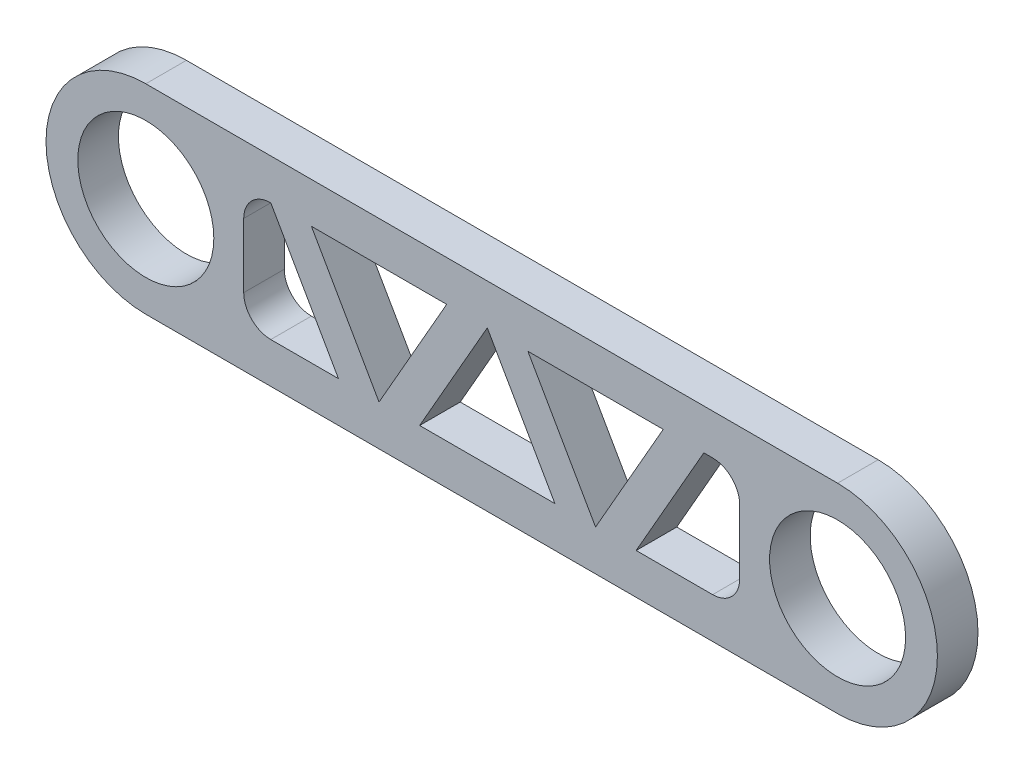
ISO-10303-21;
HEADER;
FILE_DESCRIPTION(('STEP AP214'),'2;1');
FILE_NAME('part.step','',(''),(''),'','','');
FILE_SCHEMA(('AUTOMOTIVE_DESIGN { 1 0 10303 214 1 1 1 1 }'));
ENDSEC;
DATA;
#1=APPLICATION_CONTEXT('core data for automotive mechanical design processes');
#2=APPLICATION_PROTOCOL_DEFINITION('international standard','automotive_design',2000,#1);
#3=PRODUCT_CONTEXT('',#1,'mechanical');
#4=PRODUCT('Part','Part','',(#3));
#5=PRODUCT_RELATED_PRODUCT_CATEGORY('part','',(#4));
#6=PRODUCT_DEFINITION_FORMATION('','',#4);
#7=PRODUCT_DEFINITION_CONTEXT('part definition',#1,'design');
#8=PRODUCT_DEFINITION('design','',#6,#7);
#9=PRODUCT_DEFINITION_SHAPE('','',#8);
#10=(LENGTH_UNIT() NAMED_UNIT(*) SI_UNIT(.MILLI.,.METRE.));
#11=(NAMED_UNIT(*) PLANE_ANGLE_UNIT() SI_UNIT($,.RADIAN.));
#12=(NAMED_UNIT(*) SI_UNIT($,.STERADIAN.) SOLID_ANGLE_UNIT());
#13=UNCERTAINTY_MEASURE_WITH_UNIT(LENGTH_MEASURE(1.E-05),#10,'distance_accuracy_value','');
#14=(GEOMETRIC_REPRESENTATION_CONTEXT(3) GLOBAL_UNCERTAINTY_ASSIGNED_CONTEXT((#13)) GLOBAL_UNIT_ASSIGNED_CONTEXT((#10,
#11,#12)) REPRESENTATION_CONTEXT('',''));
#15=CARTESIAN_POINT('',(0.,0.,0.));
#16=DIRECTION('',(0.,0.,1.));
#17=DIRECTION('',(1.,0.,0.));
#18=AXIS2_PLACEMENT_3D('',#15,#16,#17);
#19=CARTESIAN_POINT('',(0.,0.,-12.));
#20=DIRECTION('',(0.,0.,1.));
#21=DIRECTION('',(1.,0.,0.));
#22=AXIS2_PLACEMENT_3D('',#19,#20,#21);
#23=PLANE('',#22);
#24=CARTESIAN_POINT('',(204.48,0.,-12.));
#25=DIRECTION('',(0.,0.,1.));
#26=DIRECTION('',(1.,0.,0.));
#27=AXIS2_PLACEMENT_3D('',#24,#25,#26);
#28=CIRCLE('',#27,20.1);
#29=CARTESIAN_POINT('',(224.58,0.,-12.));
#30=VERTEX_POINT('',#29);
#31=EDGE_CURVE('E607',#30,#30,#28,.T.);
#32=ORIENTED_EDGE('',*,*,#31,.T.);
#33=EDGE_LOOP('',(#32));
#34=FACE_BOUND('',#33,.T.);
#35=CARTESIAN_POINT('',(0.,0.,-12.));
#36=DIRECTION('',(0.,0.,1.));
#37=DIRECTION('',(1.,0.,0.));
#38=AXIS2_PLACEMENT_3D('',#35,#36,#37);
#39=CIRCLE('',#38,20.1);
#40=CARTESIAN_POINT('',(20.1,0.,-12.));
#41=VERTEX_POINT('',#40);
#42=EDGE_CURVE('E321',#41,#41,#39,.T.);
#43=ORIENTED_EDGE('',*,*,#42,.T.);
#44=EDGE_LOOP('',(#43));
#45=FACE_BOUND('',#44,.T.);
#46=CARTESIAN_POINT('',(167.541061784718,9.5,-12.));
#47=DIRECTION('',(0.,0.,1.));
#48=DIRECTION('',(1.,0.,0.));
#49=AXIS2_PLACEMENT_3D('',#46,#47,#48);
#50=CIRCLE('',#49,8.);
#51=CARTESIAN_POINT('',(167.541061784718,17.5,-12.));
#52=VERTEX_POINT('',#51);
#53=CARTESIAN_POINT('',(175.541061784718,9.5,-12.));
#54=VERTEX_POINT('',#53);
#55=EDGE_CURVE('E302',#52,#54,#50,.F.);
#56=ORIENTED_EDGE('',*,*,#55,.F.);
#57=DIRECTION('',(1.,0.,0.));
#58=VECTOR('',#57,1.);
#59=CARTESIAN_POINT('',(0.,17.5,-12.));
#60=LINE('',#59,#58);
#61=CARTESIAN_POINT('',(164.938938215282,17.5,-12.));
#62=VERTEX_POINT('',#61);
#63=EDGE_CURVE('E290',#62,#52,#60,.T.);
#64=ORIENTED_EDGE('',*,*,#63,.F.);
#65=DIRECTION('',(0.496138938356834,0.868243142124459,0.));
#66=VECTOR('',#65,1.);
#67=CARTESIAN_POINT('',(116.800122654597,-66.7429272311983,-12.));
#68=LINE('',#67,#66);
#69=CARTESIAN_POINT('',(144.938938215282,-17.5,-12.));
#70=VERTEX_POINT('',#69);
#71=EDGE_CURVE('E301',#70,#62,#68,.T.);
#72=ORIENTED_EDGE('',*,*,#71,.F.);
#73=DIRECTION('',(1.,0.,0.));
#74=VECTOR('',#73,1.);
#75=CARTESIAN_POINT('',(0.,-17.5,-12.));
#76=LINE('',#75,#74);
#77=CARTESIAN_POINT('',(167.541061784718,-17.5,-12.));
#78=VERTEX_POINT('',#77);
#79=EDGE_CURVE('E325',#70,#78,#76,.T.);
#80=ORIENTED_EDGE('',*,*,#79,.T.);
#81=CARTESIAN_POINT('',(167.541061784718,-9.5,-12.));
#82=DIRECTION('',(0.,0.,1.));
#83=DIRECTION('',(1.,0.,0.));
#84=AXIS2_PLACEMENT_3D('',#81,#82,#83);
#85=CIRCLE('',#84,8.);
#86=CARTESIAN_POINT('',(175.541061784718,-9.5,-12.));
#87=VERTEX_POINT('',#86);
#88=EDGE_CURVE('E328',#78,#87,#85,.T.);
#89=ORIENTED_EDGE('',*,*,#88,.T.);
#90=DIRECTION('',(0.,-1.,0.));
#91=VECTOR('',#90,1.);
#92=CARTESIAN_POINT('',(175.541061784718,0.,-12.));
#93=LINE('',#92,#91);
#94=EDGE_CURVE('E310',#54,#87,#93,.T.);
#95=ORIENTED_EDGE('',*,*,#94,.F.);
#96=EDGE_LOOP('',(#56,#64,#72,#80,#89,#95));
#97=FACE_BOUND('',#96,.T.);
#98=DIRECTION('',(1.,0.,0.));
#99=VECTOR('',#98,1.);
#100=CARTESIAN_POINT('',(0.,17.5,-12.));
#101=LINE('',#100,#99);
#102=CARTESIAN_POINT('',(112.938938215282,17.5,-12.));
#103=VERTEX_POINT('',#102);
#104=CARTESIAN_POINT('',(152.938938215282,17.5,-12.));
#105=VERTEX_POINT('',#104);
#106=EDGE_CURVE('E359',#103,#105,#101,.T.);
#107=ORIENTED_EDGE('',*,*,#106,.F.);
#108=DIRECTION('',(0.496138938356834,-0.868243142124459,0.));
#109=VECTOR('',#108,1.);
#110=CARTESIAN_POINT('',(92.67704573152,52.9583118465829,-12.));
#111=LINE('',#110,#109);
#112=CARTESIAN_POINT('',(132.938938215282,-17.5,-12.));
#113=VERTEX_POINT('',#112);
#114=EDGE_CURVE('E352',#103,#113,#111,.T.);
#115=ORIENTED_EDGE('',*,*,#114,.T.);
#116=DIRECTION('',(0.496138938356834,0.868243142124459,0.));
#117=VECTOR('',#116,1.);
#118=CARTESIAN_POINT('',(107.753968808443,-61.5736964619675,-12.));
#119=LINE('',#118,#117);
#120=EDGE_CURVE('E355',#113,#105,#119,.T.);
#121=ORIENTED_EDGE('',*,*,#120,.T.);
#122=EDGE_LOOP('',(#107,#115,#121));
#123=FACE_BOUND('',#122,.T.);
#124=CARTESIAN_POINT('',(36.9389382152816,9.5,-12.));
#125=DIRECTION('',(0.,0.,1.));
#126=DIRECTION('',(1.,0.,0.));
#127=AXIS2_PLACEMENT_3D('',#124,#125,#126);
#128=CIRCLE('',#127,8.);
#129=CARTESIAN_POINT('',(36.9389382152816,17.5,-12.));
#130=VERTEX_POINT('',#129);
#131=CARTESIAN_POINT('',(28.9389382152816,9.5,-12.));
#132=VERTEX_POINT('',#131);
#133=EDGE_CURVE('E430',#130,#132,#128,.T.);
#134=ORIENTED_EDGE('',*,*,#133,.T.);
#135=DIRECTION('',(0.,-1.,0.));
#136=VECTOR('',#135,1.);
#137=CARTESIAN_POINT('',(28.9389382152816,0.,-12.));
#138=LINE('',#137,#136);
#139=CARTESIAN_POINT('',(28.9389382152816,-9.5,-12.));
#140=VERTEX_POINT('',#139);
#141=EDGE_CURVE('E418',#132,#140,#138,.T.);
#142=ORIENTED_EDGE('',*,*,#141,.T.);
#143=CARTESIAN_POINT('',(36.9389382152816,-9.5,-12.));
#144=DIRECTION('',(0.,0.,1.));
#145=DIRECTION('',(1.,0.,0.));
#146=AXIS2_PLACEMENT_3D('',#143,#144,#145);
#147=CIRCLE('',#146,8.);
#148=CARTESIAN_POINT('',(36.9389382152816,-17.5,-12.));
#149=VERTEX_POINT('',#148);
#150=EDGE_CURVE('E421',#140,#149,#147,.T.);
#151=ORIENTED_EDGE('',*,*,#150,.T.);
#152=DIRECTION('',(1.,0.,0.));
#153=VECTOR('',#152,1.);
#154=CARTESIAN_POINT('',(0.,-17.5,-12.));
#155=LINE('',#154,#153);
#156=CARTESIAN_POINT('',(56.9389382152816,-17.5,-12.));
#157=VERTEX_POINT('',#156);
#158=EDGE_CURVE('E425',#149,#157,#155,.T.);
#159=ORIENTED_EDGE('',*,*,#158,.T.);
#160=DIRECTION('',(0.496138938356834,-0.868243142124459,0.));
#161=VECTOR('',#160,1.);
#162=CARTESIAN_POINT('',(35.3847380392123,20.2198503081213,-12.));
#163=LINE('',#162,#161);
#164=EDGE_CURVE('E428',#130,#157,#163,.T.);
#165=ORIENTED_EDGE('',*,*,#164,.F.);
#166=EDGE_LOOP('',(#134,#142,#151,#159,#165));
#167=FACE_BOUND('',#166,.T.);
#168=CARTESIAN_POINT('',(0.,0.,-12.));
#169=DIRECTION('',(0.,0.,1.));
#170=DIRECTION('',(1.,0.,0.));
#171=AXIS2_PLACEMENT_3D('',#168,#169,#170);
#172=CIRCLE('',#171,29.5);
#173=CARTESIAN_POINT('',(0.,29.5,-12.));
#174=VERTEX_POINT('',#173);
#175=CARTESIAN_POINT('',(0.,-29.5,-12.));
#176=VERTEX_POINT('',#175);
#177=EDGE_CURVE('E457',#174,#176,#172,.T.);
#178=ORIENTED_EDGE('',*,*,#177,.F.);
#179=DIRECTION('',(1.,0.,0.));
#180=VECTOR('',#179,1.);
#181=CARTESIAN_POINT('',(0.,29.5,-12.));
#182=LINE('',#181,#180);
#183=CARTESIAN_POINT('',(204.48,29.5,-12.));
#184=VERTEX_POINT('',#183);
#185=EDGE_CURVE('E467',#174,#184,#182,.T.);
#186=ORIENTED_EDGE('',*,*,#185,.T.);
#187=CARTESIAN_POINT('',(204.48,0.,-12.));
#188=DIRECTION('',(0.,0.,1.));
#189=DIRECTION('',(1.,0.,0.));
#190=AXIS2_PLACEMENT_3D('',#187,#188,#189);
#191=CIRCLE('',#190,29.5);
#192=CARTESIAN_POINT('',(204.48,-29.5,-12.));
#193=VERTEX_POINT('',#192);
#194=EDGE_CURVE('E464',#193,#184,#191,.T.);
#195=ORIENTED_EDGE('',*,*,#194,.F.);
#196=DIRECTION('',(1.,0.,0.));
#197=VECTOR('',#196,1.);
#198=CARTESIAN_POINT('',(0.,-29.5,-12.));
#199=LINE('',#198,#197);
#200=EDGE_CURVE('E460',#176,#193,#199,.T.);
#201=ORIENTED_EDGE('',*,*,#200,.F.);
#202=EDGE_LOOP('',(#178,#186,#195,#201));
#203=FACE_BOUND('',#202,.T.);
#204=DIRECTION('',(1.,0.,0.));
#205=VECTOR('',#204,1.);
#206=CARTESIAN_POINT('',(0.,17.5,-12.));
#207=LINE('',#206,#205);
#208=CARTESIAN_POINT('',(48.9389382152816,17.5,-12.));
#209=VERTEX_POINT('',#208);
#210=CARTESIAN_POINT('',(88.9389382152817,17.5,-12.));
#211=VERTEX_POINT('',#210);
#212=EDGE_CURVE('E404',#209,#211,#207,.T.);
#213=ORIENTED_EDGE('',*,*,#212,.F.);
#214=DIRECTION('',(0.496138938356834,-0.868243142124459,0.));
#215=VECTOR('',#214,1.);
#216=CARTESIAN_POINT('',(44.4308918853661,25.3890810773521,-12.));
#217=LINE('',#216,#215);
#218=CARTESIAN_POINT('',(68.9389382152817,-17.5,-12.));
#219=VERTEX_POINT('',#218);
#220=EDGE_CURVE('E397',#209,#219,#217,.T.);
#221=ORIENTED_EDGE('',*,*,#220,.T.);
#222=DIRECTION('',(0.496138938356834,0.868243142124459,0.));
#223=VECTOR('',#222,1.);
#224=CARTESIAN_POINT('',(59.5078149622892,-34.0044656927367,-12.));
#225=LINE('',#224,#223);
#226=EDGE_CURVE('E400',#219,#211,#225,.T.);
#227=ORIENTED_EDGE('',*,*,#226,.T.);
#228=EDGE_LOOP('',(#213,#221,#227));
#229=FACE_BOUND('',#228,.T.);
#230=DIRECTION('',(0.496138938356834,-0.868243142124459,0.));
#231=VECTOR('',#230,1.);
#232=CARTESIAN_POINT('',(83.6308918853662,47.7890810773521,-12.));
#233=LINE('',#232,#231);
#234=CARTESIAN_POINT('',(100.938938215282,17.5,-12.));
#235=VERTEX_POINT('',#234);
#236=CARTESIAN_POINT('',(120.938938215282,-17.5,-12.));
#237=VERTEX_POINT('',#236);
#238=EDGE_CURVE('E376',#235,#237,#233,.T.);
#239=ORIENTED_EDGE('',*,*,#238,.F.);
#240=DIRECTION('',(0.496138938356834,0.868243142124459,0.));
#241=VECTOR('',#240,1.);
#242=CARTESIAN_POINT('',(68.5539688084431,-39.1736964619675,-12.));
#243=LINE('',#242,#241);
#244=CARTESIAN_POINT('',(80.9389382152817,-17.5,-12.));
#245=VERTEX_POINT('',#244);
#246=EDGE_CURVE('E378',#245,#235,#243,.T.);
#247=ORIENTED_EDGE('',*,*,#246,.F.);
#248=DIRECTION('',(1.,0.,0.));
#249=VECTOR('',#248,1.);
#250=CARTESIAN_POINT('',(0.,-17.5,-12.));
#251=LINE('',#250,#249);
#252=EDGE_CURVE('E143',#245,#237,#251,.T.);
#253=ORIENTED_EDGE('',*,*,#252,.T.);
#254=EDGE_LOOP('',(#239,#247,#253));
#255=FACE_BOUND('',#254,.T.);
#256=ADVANCED_FACE('F126',(#34,#45,#97,#123,#167,#203,#229,#255),#23,.F.);
#257=CARTESIAN_POINT('',(0.,0.,0.));
#258=DIRECTION('',(0.,0.,1.));
#259=DIRECTION('',(1.,0.,0.));
#260=AXIS2_PLACEMENT_3D('',#257,#258,#259);
#261=PLANE('',#260);
#262=CARTESIAN_POINT('',(204.48,0.,0.));
#263=DIRECTION('',(0.,0.,1.));
#264=DIRECTION('',(1.,0.,0.));
#265=AXIS2_PLACEMENT_3D('',#262,#263,#264);
#266=CIRCLE('',#265,20.1);
#267=CARTESIAN_POINT('',(224.58,0.,0.));
#268=VERTEX_POINT('',#267);
#269=EDGE_CURVE('E605',#268,#268,#266,.T.);
#270=ORIENTED_EDGE('',*,*,#269,.F.);
#271=EDGE_LOOP('',(#270));
#272=FACE_BOUND('',#271,.T.);
#273=CARTESIAN_POINT('',(0.,0.,0.));
#274=DIRECTION('',(0.,0.,1.));
#275=DIRECTION('',(1.,0.,0.));
#276=AXIS2_PLACEMENT_3D('',#273,#274,#275);
#277=CIRCLE('',#276,20.1);
#278=CARTESIAN_POINT('',(20.1,0.,0.));
#279=VERTEX_POINT('',#278);
#280=EDGE_CURVE('E608',#279,#279,#277,.T.);
#281=ORIENTED_EDGE('',*,*,#280,.F.);
#282=EDGE_LOOP('',(#281));
#283=FACE_BOUND('',#282,.T.);
#284=DIRECTION('',(0.496138938356834,-0.868243142124459,0.));
#285=VECTOR('',#284,1.);
#286=CARTESIAN_POINT('',(44.4308918853661,25.3890810773521,0.));
#287=LINE('',#286,#285);
#288=CARTESIAN_POINT('',(48.9389382152816,17.5,0.));
#289=VERTEX_POINT('',#288);
#290=CARTESIAN_POINT('',(68.9389382152817,-17.5,0.));
#291=VERTEX_POINT('',#290);
#292=EDGE_CURVE('E392',#289,#291,#287,.T.);
#293=ORIENTED_EDGE('',*,*,#292,.F.);
#294=DIRECTION('',(1.,0.,0.));
#295=VECTOR('',#294,1.);
#296=CARTESIAN_POINT('',(0.,17.5,0.));
#297=LINE('',#296,#295);
#298=CARTESIAN_POINT('',(88.9389382152817,17.5,0.));
#299=VERTEX_POINT('',#298);
#300=EDGE_CURVE('E401',#289,#299,#297,.T.);
#301=ORIENTED_EDGE('',*,*,#300,.T.);
#302=DIRECTION('',(0.496138938356834,0.868243142124459,0.));
#303=VECTOR('',#302,1.);
#304=CARTESIAN_POINT('',(59.5078149622892,-34.0044656927367,0.));
#305=LINE('',#304,#303);
#306=EDGE_CURVE('E408',#291,#299,#305,.T.);
#307=ORIENTED_EDGE('',*,*,#306,.F.);
#308=EDGE_LOOP('',(#293,#301,#307));
#309=FACE_BOUND('',#308,.T.);
#310=DIRECTION('',(0.496138938356834,-0.868243142124459,0.));
#311=VECTOR('',#310,1.);
#312=CARTESIAN_POINT('',(92.67704573152,52.9583118465829,0.));
#313=LINE('',#312,#311);
#314=CARTESIAN_POINT('',(112.938938215282,17.5,0.));
#315=VERTEX_POINT('',#314);
#316=CARTESIAN_POINT('',(132.938938215282,-17.5,0.));
#317=VERTEX_POINT('',#316);
#318=EDGE_CURVE('E344',#315,#317,#313,.T.);
#319=ORIENTED_EDGE('',*,*,#318,.F.);
#320=DIRECTION('',(1.,0.,0.));
#321=VECTOR('',#320,1.);
#322=CARTESIAN_POINT('',(0.,17.5,0.));
#323=LINE('',#322,#321);
#324=CARTESIAN_POINT('',(152.938938215282,17.5,0.));
#325=VERTEX_POINT('',#324);
#326=EDGE_CURVE('E356',#315,#325,#323,.T.);
#327=ORIENTED_EDGE('',*,*,#326,.T.);
#328=DIRECTION('',(0.496138938356834,0.868243142124459,0.));
#329=VECTOR('',#328,1.);
#330=CARTESIAN_POINT('',(107.753968808443,-61.5736964619675,0.));
#331=LINE('',#330,#329);
#332=EDGE_CURVE('E364',#317,#325,#331,.T.);
#333=ORIENTED_EDGE('',*,*,#332,.F.);
#334=EDGE_LOOP('',(#319,#327,#333));
#335=FACE_BOUND('',#334,.T.);
#336=DIRECTION('',(0.,-1.,0.));
#337=VECTOR('',#336,1.);
#338=CARTESIAN_POINT('',(28.9389382152816,0.,0.));
#339=LINE('',#338,#337);
#340=CARTESIAN_POINT('',(28.9389382152816,9.5,0.));
#341=VERTEX_POINT('',#340);
#342=CARTESIAN_POINT('',(28.9389382152816,-9.5,0.));
#343=VERTEX_POINT('',#342);
#344=EDGE_CURVE('E414',#341,#343,#339,.T.);
#345=ORIENTED_EDGE('',*,*,#344,.F.);
#346=CARTESIAN_POINT('',(36.9389382152816,9.5,0.));
#347=DIRECTION('',(0.,0.,1.));
#348=DIRECTION('',(1.,0.,0.));
#349=AXIS2_PLACEMENT_3D('',#346,#347,#348);
#350=CIRCLE('',#349,8.);
#351=CARTESIAN_POINT('',(36.9389382152816,17.5,0.));
#352=VERTEX_POINT('',#351);
#353=EDGE_CURVE('E422',#352,#341,#350,.T.);
#354=ORIENTED_EDGE('',*,*,#353,.F.);
#355=DIRECTION('',(0.496138938356834,-0.868243142124459,0.));
#356=VECTOR('',#355,1.);
#357=CARTESIAN_POINT('',(35.3847380392123,20.2198503081213,0.));
#358=LINE('',#357,#356);
#359=CARTESIAN_POINT('',(56.9389382152816,-17.5,0.));
#360=VERTEX_POINT('',#359);
#361=EDGE_CURVE('E441',#352,#360,#358,.T.);
#362=ORIENTED_EDGE('',*,*,#361,.T.);
#363=DIRECTION('',(1.,0.,0.));
#364=VECTOR('',#363,1.);
#365=CARTESIAN_POINT('',(0.,-17.5,0.));
#366=LINE('',#365,#364);
#367=CARTESIAN_POINT('',(36.9389382152816,-17.5,0.));
#368=VERTEX_POINT('',#367);
#369=EDGE_CURVE('E438',#368,#360,#366,.T.);
#370=ORIENTED_EDGE('',*,*,#369,.F.);
#371=CARTESIAN_POINT('',(36.9389382152816,-9.5,0.));
#372=DIRECTION('',(0.,0.,1.));
#373=DIRECTION('',(1.,0.,0.));
#374=AXIS2_PLACEMENT_3D('',#371,#372,#373);
#375=CIRCLE('',#374,8.);
#376=EDGE_CURVE('E435',#343,#368,#375,.T.);
#377=ORIENTED_EDGE('',*,*,#376,.F.);
#378=EDGE_LOOP('',(#345,#354,#362,#370,#377));
#379=FACE_BOUND('',#378,.T.);
#380=CARTESIAN_POINT('',(0.,0.,0.));
#381=DIRECTION('',(0.,0.,1.));
#382=DIRECTION('',(1.,0.,0.));
#383=AXIS2_PLACEMENT_3D('',#380,#381,#382);
#384=CIRCLE('',#383,29.5);
#385=CARTESIAN_POINT('',(0.,29.5,0.));
#386=VERTEX_POINT('',#385);
#387=CARTESIAN_POINT('',(0.,-29.5,0.));
#388=VERTEX_POINT('',#387);
#389=EDGE_CURVE('E448',#386,#388,#384,.T.);
#390=ORIENTED_EDGE('',*,*,#389,.T.);
#391=DIRECTION('',(1.,0.,0.));
#392=VECTOR('',#391,1.);
#393=CARTESIAN_POINT('',(0.,-29.5,0.));
#394=LINE('',#393,#392);
#395=CARTESIAN_POINT('',(204.48,-29.5,0.));
#396=VERTEX_POINT('',#395);
#397=EDGE_CURVE('E471',#388,#396,#394,.T.);
#398=ORIENTED_EDGE('',*,*,#397,.T.);
#399=CARTESIAN_POINT('',(204.48,0.,0.));
#400=DIRECTION('',(0.,0.,1.));
#401=DIRECTION('',(1.,0.,0.));
#402=AXIS2_PLACEMENT_3D('',#399,#400,#401);
#403=CIRCLE('',#402,29.5);
#404=CARTESIAN_POINT('',(204.48,29.5,0.));
#405=VERTEX_POINT('',#404);
#406=EDGE_CURVE('E474',#396,#405,#403,.T.);
#407=ORIENTED_EDGE('',*,*,#406,.T.);
#408=DIRECTION('',(1.,0.,0.));
#409=VECTOR('',#408,1.);
#410=CARTESIAN_POINT('',(0.,29.5,0.));
#411=LINE('',#410,#409);
#412=EDGE_CURVE('E461',#386,#405,#411,.T.);
#413=ORIENTED_EDGE('',*,*,#412,.F.);
#414=EDGE_LOOP('',(#390,#398,#407,#413));
#415=FACE_BOUND('',#414,.T.);
#416=DIRECTION('',(1.,0.,0.));
#417=VECTOR('',#416,1.);
#418=CARTESIAN_POINT('',(0.,17.5,0.));
#419=LINE('',#418,#417);
#420=CARTESIAN_POINT('',(164.938938215282,17.5,0.));
#421=VERTEX_POINT('',#420);
#422=CARTESIAN_POINT('',(167.541061784718,17.5,0.));
#423=VERTEX_POINT('',#422);
#424=EDGE_CURVE('E332',#421,#423,#419,.T.);
#425=ORIENTED_EDGE('',*,*,#424,.T.);
#426=CARTESIAN_POINT('',(167.541061784718,9.5,0.));
#427=DIRECTION('',(0.,0.,1.));
#428=DIRECTION('',(1.,0.,0.));
#429=AXIS2_PLACEMENT_3D('',#426,#427,#428);
#430=CIRCLE('',#429,8.);
#431=CARTESIAN_POINT('',(175.541061784718,9.5,0.));
#432=VERTEX_POINT('',#431);
#433=EDGE_CURVE('E309',#423,#432,#430,.F.);
#434=ORIENTED_EDGE('',*,*,#433,.T.);
#435=DIRECTION('',(0.,-1.,0.));
#436=VECTOR('',#435,1.);
#437=CARTESIAN_POINT('',(175.541061784718,0.,0.));
#438=LINE('',#437,#436);
#439=CARTESIAN_POINT('',(175.541061784718,-9.5,0.));
#440=VERTEX_POINT('',#439);
#441=EDGE_CURVE('E315',#432,#440,#438,.T.);
#442=ORIENTED_EDGE('',*,*,#441,.T.);
#443=CARTESIAN_POINT('',(167.541061784718,-9.5,0.));
#444=DIRECTION('',(0.,0.,1.));
#445=DIRECTION('',(1.,0.,0.));
#446=AXIS2_PLACEMENT_3D('',#443,#444,#445);
#447=CIRCLE('',#446,8.);
#448=CARTESIAN_POINT('',(167.541061784718,-17.5,0.));
#449=VERTEX_POINT('',#448);
#450=EDGE_CURVE('E318',#449,#440,#447,.T.);
#451=ORIENTED_EDGE('',*,*,#450,.F.);
#452=DIRECTION('',(1.,0.,0.));
#453=VECTOR('',#452,1.);
#454=CARTESIAN_POINT('',(0.,-17.5,0.));
#455=LINE('',#454,#453);
#456=CARTESIAN_POINT('',(144.938938215282,-17.5,0.));
#457=VERTEX_POINT('',#456);
#458=EDGE_CURVE('E337',#457,#449,#455,.T.);
#459=ORIENTED_EDGE('',*,*,#458,.F.);
#460=DIRECTION('',(0.496138938356834,0.868243142124459,0.));
#461=VECTOR('',#460,1.);
#462=CARTESIAN_POINT('',(116.800122654597,-66.7429272311983,0.));
#463=LINE('',#462,#461);
#464=EDGE_CURVE('E334',#457,#421,#463,.T.);
#465=ORIENTED_EDGE('',*,*,#464,.T.);
#466=EDGE_LOOP('',(#425,#434,#442,#451,#459,#465));
#467=FACE_BOUND('',#466,.T.);
#468=DIRECTION('',(0.496138938356834,0.868243142124459,0.));
#469=VECTOR('',#468,1.);
#470=CARTESIAN_POINT('',(68.5539688084431,-39.1736964619675,0.));
#471=LINE('',#470,#469);
#472=CARTESIAN_POINT('',(80.9389382152817,-17.5,0.));
#473=VERTEX_POINT('',#472);
#474=CARTESIAN_POINT('',(100.938938215282,17.5,0.));
#475=VERTEX_POINT('',#474);
#476=EDGE_CURVE('E385',#473,#475,#471,.T.);
#477=ORIENTED_EDGE('',*,*,#476,.T.);
#478=DIRECTION('',(0.496138938356834,-0.868243142124459,0.));
#479=VECTOR('',#478,1.);
#480=CARTESIAN_POINT('',(83.6308918853662,47.7890810773521,0.));
#481=LINE('',#480,#479);
#482=CARTESIAN_POINT('',(120.938938215282,-17.5,0.));
#483=VERTEX_POINT('',#482);
#484=EDGE_CURVE('E371',#475,#483,#481,.T.);
#485=ORIENTED_EDGE('',*,*,#484,.T.);
#486=DIRECTION('',(1.,0.,0.));
#487=VECTOR('',#486,1.);
#488=CARTESIAN_POINT('',(0.,-17.5,0.));
#489=LINE('',#488,#487);
#490=EDGE_CURVE('E379',#473,#483,#489,.T.);
#491=ORIENTED_EDGE('',*,*,#490,.F.);
#492=EDGE_LOOP('',(#477,#485,#491));
#493=FACE_BOUND('',#492,.T.);
#494=ADVANCED_FACE('F490',(#272,#283,#309,#335,#379,#415,#467,#493),#261,.T.);
#495=CARTESIAN_POINT('',(0.,0.,-12.));
#496=DIRECTION('',(0.,0.,1.));
#497=DIRECTION('',(1.,0.,0.));
#498=AXIS2_PLACEMENT_3D('',#495,#496,#497);
#499=CYLINDRICAL_SURFACE('',#498,29.5);
#500=ORIENTED_EDGE('',*,*,#389,.F.);
#501=DIRECTION('',(0.,0.,1.));
#502=VECTOR('',#501,1.);
#503=CARTESIAN_POINT('',(0.,29.5,-12.));
#504=LINE('',#503,#502);
#505=EDGE_CURVE('E12',#174,#386,#504,.T.);
#506=ORIENTED_EDGE('',*,*,#505,.F.);
#507=ORIENTED_EDGE('',*,*,#177,.T.);
#508=DIRECTION('',(0.,0.,1.));
#509=VECTOR('',#508,1.);
#510=CARTESIAN_POINT('',(0.,-29.5,-12.));
#511=LINE('',#510,#509);
#512=EDGE_CURVE('E130',#176,#388,#511,.T.);
#513=ORIENTED_EDGE('',*,*,#512,.T.);
#514=EDGE_LOOP('',(#500,#506,#507,#513));
#515=FACE_BOUND('',#514,.T.);
#516=ADVANCED_FACE('F128',(#515),#499,.T.);
#517=CARTESIAN_POINT('',(0.,29.5,-12.));
#518=DIRECTION('',(0.,-1.,0.));
#519=DIRECTION('',(0.,0.,-1.));
#520=AXIS2_PLACEMENT_3D('',#517,#518,#519);
#521=PLANE('',#520);
#522=ORIENTED_EDGE('',*,*,#412,.T.);
#523=DIRECTION('',(0.,0.,1.));
#524=VECTOR('',#523,1.);
#525=CARTESIAN_POINT('',(204.48,29.5,-12.));
#526=LINE('',#525,#524);
#527=EDGE_CURVE('E135',#184,#405,#526,.T.);
#528=ORIENTED_EDGE('',*,*,#527,.F.);
#529=ORIENTED_EDGE('',*,*,#185,.F.);
#530=ORIENTED_EDGE('',*,*,#505,.T.);
#531=EDGE_LOOP('',(#522,#528,#529,#530));
#532=FACE_BOUND('',#531,.T.);
#533=ADVANCED_FACE('F494',(#532),#521,.F.);
#534=CARTESIAN_POINT('',(204.48,0.,-12.));
#535=DIRECTION('',(0.,0.,1.));
#536=DIRECTION('',(1.,0.,0.));
#537=AXIS2_PLACEMENT_3D('',#534,#535,#536);
#538=CYLINDRICAL_SURFACE('',#537,29.5);
#539=ORIENTED_EDGE('',*,*,#406,.F.);
#540=DIRECTION('',(0.,0.,1.));
#541=VECTOR('',#540,1.);
#542=CARTESIAN_POINT('',(204.48,-29.5,-12.));
#543=LINE('',#542,#541);
#544=EDGE_CURVE('E479',#193,#396,#543,.T.);
#545=ORIENTED_EDGE('',*,*,#544,.F.);
#546=ORIENTED_EDGE('',*,*,#194,.T.);
#547=ORIENTED_EDGE('',*,*,#527,.T.);
#548=EDGE_LOOP('',(#539,#545,#546,#547));
#549=FACE_BOUND('',#548,.T.);
#550=ADVANCED_FACE('F500',(#549),#538,.T.);
#551=CARTESIAN_POINT('',(0.,-29.5,-12.));
#552=DIRECTION('',(0.,-1.,0.));
#553=DIRECTION('',(0.,0.,-1.));
#554=AXIS2_PLACEMENT_3D('',#551,#552,#553);
#555=PLANE('',#554);
#556=ORIENTED_EDGE('',*,*,#397,.F.);
#557=ORIENTED_EDGE('',*,*,#512,.F.);
#558=ORIENTED_EDGE('',*,*,#200,.T.);
#559=ORIENTED_EDGE('',*,*,#544,.T.);
#560=EDGE_LOOP('',(#556,#557,#558,#559));
#561=FACE_BOUND('',#560,.T.);
#562=ADVANCED_FACE('F487',(#561),#555,.T.);
#563=CARTESIAN_POINT('',(28.9389382152816,0.,-12.));
#564=DIRECTION('',(-1.,0.,0.));
#565=DIRECTION('',(0.,0.,1.));
#566=AXIS2_PLACEMENT_3D('',#563,#564,#565);
#567=PLANE('',#566);
#568=ORIENTED_EDGE('',*,*,#344,.T.);
#569=DIRECTION('',(0.,0.,1.));
#570=VECTOR('',#569,1.);
#571=CARTESIAN_POINT('',(28.9389382152816,-9.5,-12.));
#572=LINE('',#571,#570);
#573=EDGE_CURVE('E433',#140,#343,#572,.T.);
#574=ORIENTED_EDGE('',*,*,#573,.F.);
#575=ORIENTED_EDGE('',*,*,#141,.F.);
#576=DIRECTION('',(0.,0.,1.));
#577=VECTOR('',#576,1.);
#578=CARTESIAN_POINT('',(28.9389382152816,9.5,-12.));
#579=LINE('',#578,#577);
#580=EDGE_CURVE('E446',#132,#341,#579,.T.);
#581=ORIENTED_EDGE('',*,*,#580,.T.);
#582=EDGE_LOOP('',(#568,#574,#575,#581));
#583=FACE_BOUND('',#582,.T.);
#584=ADVANCED_FACE('F507',(#583),#567,.F.);
#585=CARTESIAN_POINT('',(36.9389382152816,9.5,-12.));
#586=DIRECTION('',(0.,0.,1.));
#587=DIRECTION('',(1.,0.,0.));
#588=AXIS2_PLACEMENT_3D('',#585,#586,#587);
#589=CYLINDRICAL_SURFACE('',#588,8.);
#590=ORIENTED_EDGE('',*,*,#353,.T.);
#591=ORIENTED_EDGE('',*,*,#580,.F.);
#592=ORIENTED_EDGE('',*,*,#133,.F.);
#593=DIRECTION('',(0.,0.,1.));
#594=VECTOR('',#593,1.);
#595=CARTESIAN_POINT('',(36.9389382152816,17.5,-12.));
#596=LINE('',#595,#594);
#597=EDGE_CURVE('E449',#130,#352,#596,.T.);
#598=ORIENTED_EDGE('',*,*,#597,.T.);
#599=EDGE_LOOP('',(#590,#591,#592,#598));
#600=FACE_BOUND('',#599,.T.);
#601=ADVANCED_FACE('F523',(#600),#589,.F.);
#602=CARTESIAN_POINT('',(35.3847380392123,20.2198503081213,-12.));
#603=DIRECTION('',(-0.868243142124459,-0.496138938356834,0.));
#604=DIRECTION('',(0.496138938356834,-0.868243142124459,0.));
#605=AXIS2_PLACEMENT_3D('',#602,#603,#604);
#606=PLANE('',#605);
#607=ORIENTED_EDGE('',*,*,#361,.F.);
#608=ORIENTED_EDGE('',*,*,#597,.F.);
#609=ORIENTED_EDGE('',*,*,#164,.T.);
#610=DIRECTION('',(0.,0.,1.));
#611=VECTOR('',#610,1.);
#612=CARTESIAN_POINT('',(56.9389382152816,-17.5,-12.));
#613=LINE('',#612,#611);
#614=EDGE_CURVE('E451',#157,#360,#613,.T.);
#615=ORIENTED_EDGE('',*,*,#614,.T.);
#616=EDGE_LOOP('',(#607,#608,#609,#615));
#617=FACE_BOUND('',#616,.T.);
#618=ADVANCED_FACE('F533',(#617),#606,.T.);
#619=CARTESIAN_POINT('',(0.,-17.5,-12.));
#620=DIRECTION('',(0.,-1.,0.));
#621=DIRECTION('',(0.,0.,-1.));
#622=AXIS2_PLACEMENT_3D('',#619,#620,#621);
#623=PLANE('',#622);
#624=ORIENTED_EDGE('',*,*,#369,.T.);
#625=ORIENTED_EDGE('',*,*,#614,.F.);
#626=ORIENTED_EDGE('',*,*,#158,.F.);
#627=DIRECTION('',(0.,0.,1.));
#628=VECTOR('',#627,1.);
#629=CARTESIAN_POINT('',(36.9389382152816,-17.5,-12.));
#630=LINE('',#629,#628);
#631=EDGE_CURVE('E453',#149,#368,#630,.T.);
#632=ORIENTED_EDGE('',*,*,#631,.T.);
#633=EDGE_LOOP('',(#624,#625,#626,#632));
#634=FACE_BOUND('',#633,.T.);
#635=ADVANCED_FACE('F529',(#634),#623,.F.);
#636=CARTESIAN_POINT('',(36.9389382152816,-9.5,-12.));
#637=DIRECTION('',(0.,0.,1.));
#638=DIRECTION('',(1.,0.,0.));
#639=AXIS2_PLACEMENT_3D('',#636,#637,#638);
#640=CYLINDRICAL_SURFACE('',#639,8.);
#641=ORIENTED_EDGE('',*,*,#376,.T.);
#642=ORIENTED_EDGE('',*,*,#631,.F.);
#643=ORIENTED_EDGE('',*,*,#150,.F.);
#644=ORIENTED_EDGE('',*,*,#573,.T.);
#645=EDGE_LOOP('',(#641,#642,#643,#644));
#646=FACE_BOUND('',#645,.T.);
#647=ADVANCED_FACE('F525',(#646),#640,.F.);
#648=CARTESIAN_POINT('',(92.67704573152,52.9583118465829,-12.));
#649=DIRECTION('',(-0.868243142124459,-0.496138938356834,0.));
#650=DIRECTION('',(0.496138938356834,-0.868243142124459,0.));
#651=AXIS2_PLACEMENT_3D('',#648,#649,#650);
#652=PLANE('',#651);
#653=ORIENTED_EDGE('',*,*,#318,.T.);
#654=DIRECTION('',(0.,0.,1.));
#655=VECTOR('',#654,1.);
#656=CARTESIAN_POINT('',(132.938938215282,-17.5,-12.));
#657=LINE('',#656,#655);
#658=EDGE_CURVE('E362',#113,#317,#657,.T.);
#659=ORIENTED_EDGE('',*,*,#658,.F.);
#660=ORIENTED_EDGE('',*,*,#114,.F.);
#661=DIRECTION('',(0.,0.,1.));
#662=VECTOR('',#661,1.);
#663=CARTESIAN_POINT('',(112.938938215282,17.5,-12.));
#664=LINE('',#663,#662);
#665=EDGE_CURVE('E369',#103,#315,#664,.T.);
#666=ORIENTED_EDGE('',*,*,#665,.T.);
#667=EDGE_LOOP('',(#653,#659,#660,#666));
#668=FACE_BOUND('',#667,.T.);
#669=ADVANCED_FACE('F528',(#668),#652,.F.);
#670=CARTESIAN_POINT('',(0.,17.5,-12.));
#671=DIRECTION('',(0.,-1.,0.));
#672=DIRECTION('',(0.,0.,-1.));
#673=AXIS2_PLACEMENT_3D('',#670,#671,#672);
#674=PLANE('',#673);
#675=ORIENTED_EDGE('',*,*,#326,.F.);
#676=ORIENTED_EDGE('',*,*,#665,.F.);
#677=ORIENTED_EDGE('',*,*,#106,.T.);
#678=DIRECTION('',(0.,0.,1.));
#679=VECTOR('',#678,1.);
#680=CARTESIAN_POINT('',(152.938938215282,17.5,-12.));
#681=LINE('',#680,#679);
#682=EDGE_CURVE('E372',#105,#325,#681,.T.);
#683=ORIENTED_EDGE('',*,*,#682,.T.);
#684=EDGE_LOOP('',(#675,#676,#677,#683));
#685=FACE_BOUND('',#684,.T.);
#686=ADVANCED_FACE('F566',(#685),#674,.T.);
#687=CARTESIAN_POINT('',(107.753968808443,-61.5736964619675,-12.));
#688=DIRECTION('',(0.868243142124459,-0.496138938356834,0.));
#689=DIRECTION('',(0.496138938356834,0.868243142124459,0.));
#690=AXIS2_PLACEMENT_3D('',#687,#688,#689);
#691=PLANE('',#690);
#692=ORIENTED_EDGE('',*,*,#332,.T.);
#693=ORIENTED_EDGE('',*,*,#682,.F.);
#694=ORIENTED_EDGE('',*,*,#120,.F.);
#695=ORIENTED_EDGE('',*,*,#658,.T.);
#696=EDGE_LOOP('',(#692,#693,#694,#695));
#697=FACE_BOUND('',#696,.T.);
#698=ADVANCED_FACE('F568',(#697),#691,.F.);
#699=CARTESIAN_POINT('',(167.541061784718,9.5,-12.));
#700=DIRECTION('',(0.,0.,1.));
#701=DIRECTION('',(1.,0.,0.));
#702=AXIS2_PLACEMENT_3D('',#699,#700,#701);
#703=CYLINDRICAL_SURFACE('',#702,8.);
#704=ORIENTED_EDGE('',*,*,#433,.F.);
#705=DIRECTION('',(0.,0.,1.));
#706=VECTOR('',#705,1.);
#707=CARTESIAN_POINT('',(167.541061784718,17.5,-12.));
#708=LINE('',#707,#706);
#709=EDGE_CURVE('E294',#52,#423,#708,.T.);
#710=ORIENTED_EDGE('',*,*,#709,.F.);
#711=ORIENTED_EDGE('',*,*,#55,.T.);
#712=DIRECTION('',(0.,0.,1.));
#713=VECTOR('',#712,1.);
#714=CARTESIAN_POINT('',(175.541061784718,9.5,-12.));
#715=LINE('',#714,#713);
#716=EDGE_CURVE('E342',#54,#432,#715,.T.);
#717=ORIENTED_EDGE('',*,*,#716,.T.);
#718=EDGE_LOOP('',(#704,#710,#711,#717));
#719=FACE_BOUND('',#718,.T.);
#720=ADVANCED_FACE('F305',(#719),#703,.F.);
#721=CARTESIAN_POINT('',(175.541061784718,0.,-12.));
#722=DIRECTION('',(-1.,0.,0.));
#723=DIRECTION('',(0.,0.,1.));
#724=AXIS2_PLACEMENT_3D('',#721,#722,#723);
#725=PLANE('',#724);
#726=ORIENTED_EDGE('',*,*,#441,.F.);
#727=ORIENTED_EDGE('',*,*,#716,.F.);
#728=ORIENTED_EDGE('',*,*,#94,.T.);
#729=DIRECTION('',(0.,0.,1.));
#730=VECTOR('',#729,1.);
#731=CARTESIAN_POINT('',(175.541061784718,-9.5,-12.));
#732=LINE('',#731,#730);
#733=EDGE_CURVE('E345',#87,#440,#732,.T.);
#734=ORIENTED_EDGE('',*,*,#733,.T.);
#735=EDGE_LOOP('',(#726,#727,#728,#734));
#736=FACE_BOUND('',#735,.T.);
#737=ADVANCED_FACE('F577',(#736),#725,.T.);
#738=CARTESIAN_POINT('',(167.541061784718,-9.5,-12.));
#739=DIRECTION('',(0.,0.,1.));
#740=DIRECTION('',(1.,0.,0.));
#741=AXIS2_PLACEMENT_3D('',#738,#739,#740);
#742=CYLINDRICAL_SURFACE('',#741,8.);
#743=ORIENTED_EDGE('',*,*,#450,.T.);
#744=ORIENTED_EDGE('',*,*,#733,.F.);
#745=ORIENTED_EDGE('',*,*,#88,.F.);
#746=DIRECTION('',(0.,0.,1.));
#747=VECTOR('',#746,1.);
#748=CARTESIAN_POINT('',(167.541061784718,-17.5,-12.));
#749=LINE('',#748,#747);
#750=EDGE_CURVE('E347',#78,#449,#749,.T.);
#751=ORIENTED_EDGE('',*,*,#750,.T.);
#752=EDGE_LOOP('',(#743,#744,#745,#751));
#753=FACE_BOUND('',#752,.T.);
#754=ADVANCED_FACE('F587',(#753),#742,.F.);
#755=CARTESIAN_POINT('',(0.,-17.5,-12.));
#756=DIRECTION('',(0.,-1.,0.));
#757=DIRECTION('',(0.,0.,-1.));
#758=AXIS2_PLACEMENT_3D('',#755,#756,#757);
#759=PLANE('',#758);
#760=ORIENTED_EDGE('',*,*,#458,.T.);
#761=ORIENTED_EDGE('',*,*,#750,.F.);
#762=ORIENTED_EDGE('',*,*,#79,.F.);
#763=DIRECTION('',(0.,0.,1.));
#764=VECTOR('',#763,1.);
#765=CARTESIAN_POINT('',(144.938938215282,-17.5,-12.));
#766=LINE('',#765,#764);
#767=EDGE_CURVE('E349',#70,#457,#766,.T.);
#768=ORIENTED_EDGE('',*,*,#767,.T.);
#769=EDGE_LOOP('',(#760,#761,#762,#768));
#770=FACE_BOUND('',#769,.T.);
#771=ADVANCED_FACE('F583',(#770),#759,.F.);
#772=CARTESIAN_POINT('',(116.800122654597,-66.7429272311983,-12.));
#773=DIRECTION('',(0.868243142124459,-0.496138938356834,0.));
#774=DIRECTION('',(0.496138938356834,0.868243142124459,0.));
#775=AXIS2_PLACEMENT_3D('',#772,#773,#774);
#776=PLANE('',#775);
#777=ORIENTED_EDGE('',*,*,#464,.F.);
#778=ORIENTED_EDGE('',*,*,#767,.F.);
#779=ORIENTED_EDGE('',*,*,#71,.T.);
#780=DIRECTION('',(0.,0.,1.));
#781=VECTOR('',#780,1.);
#782=CARTESIAN_POINT('',(164.938938215282,17.5,-12.));
#783=LINE('',#782,#781);
#784=EDGE_CURVE('E296',#62,#421,#783,.T.);
#785=ORIENTED_EDGE('',*,*,#784,.T.);
#786=EDGE_LOOP('',(#777,#778,#779,#785));
#787=FACE_BOUND('',#786,.T.);
#788=ADVANCED_FACE('F580',(#787),#776,.T.);
#789=CARTESIAN_POINT('',(0.,17.5,-12.));
#790=DIRECTION('',(0.,-1.,0.));
#791=DIRECTION('',(0.,0.,-1.));
#792=AXIS2_PLACEMENT_3D('',#789,#790,#791);
#793=PLANE('',#792);
#794=ORIENTED_EDGE('',*,*,#424,.F.);
#795=ORIENTED_EDGE('',*,*,#784,.F.);
#796=ORIENTED_EDGE('',*,*,#63,.T.);
#797=ORIENTED_EDGE('',*,*,#709,.T.);
#798=EDGE_LOOP('',(#794,#795,#796,#797));
#799=FACE_BOUND('',#798,.T.);
#800=ADVANCED_FACE('F293',(#799),#793,.T.);
#801=CARTESIAN_POINT('',(44.4308918853661,25.3890810773521,-12.));
#802=DIRECTION('',(-0.868243142124459,-0.496138938356834,0.));
#803=DIRECTION('',(0.496138938356834,-0.868243142124459,0.));
#804=AXIS2_PLACEMENT_3D('',#801,#802,#803);
#805=PLANE('',#804);
#806=ORIENTED_EDGE('',*,*,#292,.T.);
#807=DIRECTION('',(0.,0.,1.));
#808=VECTOR('',#807,1.);
#809=CARTESIAN_POINT('',(68.9389382152817,-17.5,-12.));
#810=LINE('',#809,#808);
#811=EDGE_CURVE('E406',#219,#291,#810,.T.);
#812=ORIENTED_EDGE('',*,*,#811,.F.);
#813=ORIENTED_EDGE('',*,*,#220,.F.);
#814=DIRECTION('',(0.,0.,1.));
#815=VECTOR('',#814,1.);
#816=CARTESIAN_POINT('',(48.9389382152816,17.5,-12.));
#817=LINE('',#816,#815);
#818=EDGE_CURVE('E412',#209,#289,#817,.T.);
#819=ORIENTED_EDGE('',*,*,#818,.T.);
#820=EDGE_LOOP('',(#806,#812,#813,#819));
#821=FACE_BOUND('',#820,.T.);
#822=ADVANCED_FACE('F541',(#821),#805,.F.);
#823=CARTESIAN_POINT('',(0.,17.5,-12.));
#824=DIRECTION('',(0.,-1.,0.));
#825=DIRECTION('',(0.,0.,-1.));
#826=AXIS2_PLACEMENT_3D('',#823,#824,#825);
#827=PLANE('',#826);
#828=ORIENTED_EDGE('',*,*,#300,.F.);
#829=ORIENTED_EDGE('',*,*,#818,.F.);
#830=ORIENTED_EDGE('',*,*,#212,.T.);
#831=DIRECTION('',(0.,0.,1.));
#832=VECTOR('',#831,1.);
#833=CARTESIAN_POINT('',(88.9389382152817,17.5,-12.));
#834=LINE('',#833,#832);
#835=EDGE_CURVE('E151',#211,#299,#834,.T.);
#836=ORIENTED_EDGE('',*,*,#835,.T.);
#837=EDGE_LOOP('',(#828,#829,#830,#836));
#838=FACE_BOUND('',#837,.T.);
#839=ADVANCED_FACE('F544',(#838),#827,.T.);
#840=CARTESIAN_POINT('',(59.5078149622892,-34.0044656927367,-12.));
#841=DIRECTION('',(0.868243142124459,-0.496138938356834,0.));
#842=DIRECTION('',(0.496138938356834,0.868243142124459,0.));
#843=AXIS2_PLACEMENT_3D('',#840,#841,#842);
#844=PLANE('',#843);
#845=ORIENTED_EDGE('',*,*,#306,.T.);
#846=ORIENTED_EDGE('',*,*,#835,.F.);
#847=ORIENTED_EDGE('',*,*,#226,.F.);
#848=ORIENTED_EDGE('',*,*,#811,.T.);
#849=EDGE_LOOP('',(#845,#846,#847,#848));
#850=FACE_BOUND('',#849,.T.);
#851=ADVANCED_FACE('F546',(#850),#844,.F.);
#852=CARTESIAN_POINT('',(83.6308918853662,47.7890810773521,-12.));
#853=DIRECTION('',(-0.868243142124459,-0.496138938356834,0.));
#854=DIRECTION('',(0.496138938356834,-0.868243142124459,0.));
#855=AXIS2_PLACEMENT_3D('',#852,#853,#854);
#856=PLANE('',#855);
#857=ORIENTED_EDGE('',*,*,#484,.F.);
#858=DIRECTION('',(0.,0.,1.));
#859=VECTOR('',#858,1.);
#860=CARTESIAN_POINT('',(100.938938215282,17.5,-12.));
#861=LINE('',#860,#859);
#862=EDGE_CURVE('E382',#235,#475,#861,.T.);
#863=ORIENTED_EDGE('',*,*,#862,.F.);
#864=ORIENTED_EDGE('',*,*,#238,.T.);
#865=DIRECTION('',(0.,0.,1.));
#866=VECTOR('',#865,1.);
#867=CARTESIAN_POINT('',(120.938938215282,-17.5,-12.));
#868=LINE('',#867,#866);
#869=EDGE_CURVE('E390',#237,#483,#868,.T.);
#870=ORIENTED_EDGE('',*,*,#869,.T.);
#871=EDGE_LOOP('',(#857,#863,#864,#870));
#872=FACE_BOUND('',#871,.T.);
#873=ADVANCED_FACE('F549',(#872),#856,.T.);
#874=CARTESIAN_POINT('',(0.,-17.5,-12.));
#875=DIRECTION('',(0.,-1.,0.));
#876=DIRECTION('',(0.,0.,-1.));
#877=AXIS2_PLACEMENT_3D('',#874,#875,#876);
#878=PLANE('',#877);
#879=ORIENTED_EDGE('',*,*,#490,.T.);
#880=ORIENTED_EDGE('',*,*,#869,.F.);
#881=ORIENTED_EDGE('',*,*,#252,.F.);
#882=DIRECTION('',(0.,0.,1.));
#883=VECTOR('',#882,1.);
#884=CARTESIAN_POINT('',(80.9389382152817,-17.5,-12.));
#885=LINE('',#884,#883);
#886=EDGE_CURVE('E393',#245,#473,#885,.T.);
#887=ORIENTED_EDGE('',*,*,#886,.T.);
#888=EDGE_LOOP('',(#879,#880,#881,#887));
#889=FACE_BOUND('',#888,.T.);
#890=ADVANCED_FACE('F555',(#889),#878,.F.);
#891=CARTESIAN_POINT('',(68.5539688084431,-39.1736964619675,-12.));
#892=DIRECTION('',(0.868243142124459,-0.496138938356834,0.));
#893=DIRECTION('',(0.496138938356834,0.868243142124459,0.));
#894=AXIS2_PLACEMENT_3D('',#891,#892,#893);
#895=PLANE('',#894);
#896=ORIENTED_EDGE('',*,*,#476,.F.);
#897=ORIENTED_EDGE('',*,*,#886,.F.);
#898=ORIENTED_EDGE('',*,*,#246,.T.);
#899=ORIENTED_EDGE('',*,*,#862,.T.);
#900=EDGE_LOOP('',(#896,#897,#898,#899));
#901=FACE_BOUND('',#900,.T.);
#902=ADVANCED_FACE('F557',(#901),#895,.T.);
#903=CARTESIAN_POINT('',(0.,0.,-19.));
#904=DIRECTION('',(0.,0.,1.));
#905=DIRECTION('',(1.,0.,0.));
#906=AXIS2_PLACEMENT_3D('',#903,#904,#905);
#907=CYLINDRICAL_SURFACE('',#906,20.1);
#908=ORIENTED_EDGE('',*,*,#280,.T.);
#909=EDGE_LOOP('',(#908));
#910=FACE_BOUND('',#909,.T.);
#911=ORIENTED_EDGE('',*,*,#42,.F.);
#912=EDGE_LOOP('',(#911));
#913=FACE_BOUND('',#912,.T.);
#914=ADVANCED_FACE('F560',(#910,#913),#907,.F.);
#915=CARTESIAN_POINT('',(204.48,0.,-19.));
#916=DIRECTION('',(0.,0.,1.));
#917=DIRECTION('',(1.,0.,0.));
#918=AXIS2_PLACEMENT_3D('',#915,#916,#917);
#919=CYLINDRICAL_SURFACE('',#918,20.1);
#920=ORIENTED_EDGE('',*,*,#269,.T.);
#921=EDGE_LOOP('',(#920));
#922=FACE_BOUND('',#921,.T.);
#923=ORIENTED_EDGE('',*,*,#31,.F.);
#924=EDGE_LOOP('',(#923));
#925=FACE_BOUND('',#924,.T.);
#926=ADVANCED_FACE('F596',(#922,#925),#919,.F.);
#927=CLOSED_SHELL('',(#256,#494,#516,#533,#550,#562,#584,#601,#618,#635,#647,#669,#686,#698,
#720,#737,#754,#771,#788,#800,#822,#839,#851,#873,#890,#902,#914,#926));
#928=MANIFOLD_SOLID_BREP('B2',#927);
#929=ADVANCED_BREP_SHAPE_REPRESENTATION('',(#18,#928),#14);
#930=SHAPE_DEFINITION_REPRESENTATION(#9,#929);
ENDSEC;
END-ISO-10303-21;
